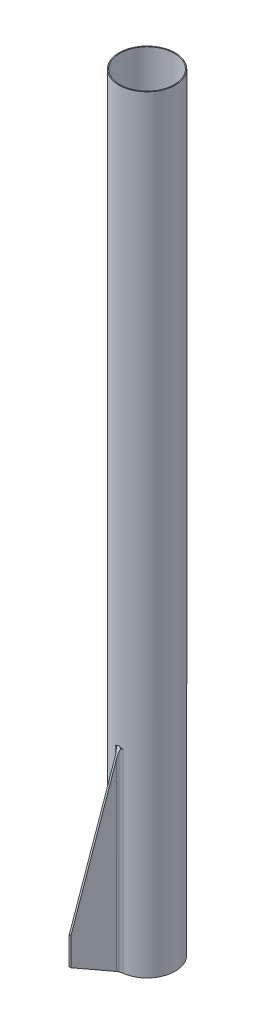
ISO-10303-21;
HEADER;
FILE_DESCRIPTION(('STEP AP214'),'2;1');
FILE_NAME('part.step','',(''),(''),'','','');
FILE_SCHEMA(('AUTOMOTIVE_DESIGN { 1 0 10303 214 1 1 1 1 }'));
ENDSEC;
DATA;
#1=APPLICATION_CONTEXT('core data for automotive mechanical design processes');
#2=APPLICATION_PROTOCOL_DEFINITION('international standard','automotive_design',2000,#1);
#3=PRODUCT_CONTEXT('',#1,'mechanical');
#4=PRODUCT('Part','Part','',(#3));
#5=PRODUCT_RELATED_PRODUCT_CATEGORY('part','',(#4));
#6=PRODUCT_DEFINITION_FORMATION('','',#4);
#7=PRODUCT_DEFINITION_CONTEXT('part definition',#1,'design');
#8=PRODUCT_DEFINITION('design','',#6,#7);
#9=PRODUCT_DEFINITION_SHAPE('','',#8);
#10=(LENGTH_UNIT() NAMED_UNIT(*) SI_UNIT(.MILLI.,.METRE.));
#11=(NAMED_UNIT(*) PLANE_ANGLE_UNIT() SI_UNIT($,.RADIAN.));
#12=(NAMED_UNIT(*) SI_UNIT($,.STERADIAN.) SOLID_ANGLE_UNIT());
#13=UNCERTAINTY_MEASURE_WITH_UNIT(LENGTH_MEASURE(1.E-05),#10,'distance_accuracy_value','');
#14=(GEOMETRIC_REPRESENTATION_CONTEXT(3) GLOBAL_UNCERTAINTY_ASSIGNED_CONTEXT((#13)) GLOBAL_UNIT_ASSIGNED_CONTEXT((#10,
#11,#12)) REPRESENTATION_CONTEXT('',''));
#15=CARTESIAN_POINT('',(0.,0.,0.));
#16=DIRECTION('',(0.,0.,1.));
#17=DIRECTION('',(1.,0.,0.));
#18=AXIS2_PLACEMENT_3D('',#15,#16,#17);
#19=CARTESIAN_POINT('',(0.,1397.,0.));
#20=DIRECTION('',(0.,-1.,0.));
#21=DIRECTION('',(0.,0.,-1.));
#22=AXIS2_PLACEMENT_3D('',#19,#20,#21);
#23=CYLINDRICAL_SURFACE('',#22,51.1175);
#24=CARTESIAN_POINT('',(-7.06042817679558,353.06,50.6275533697838));
#25=CARTESIAN_POINT('',(-6.98178910442708,353.059995409037,50.6385205075114));
#26=CARTESIAN_POINT('',(-6.90313413518507,353.061674923988,50.6493024765275));
#27=CARTESIAN_POINT('',(-6.74592232785326,353.068358490297,50.6704807973714));
#28=CARTESIAN_POINT('',(-6.66736547972724,353.073362167958,50.6808771924061));
#29=CARTESIAN_POINT('',(-6.4322747485373,353.093272134073,50.7114343822477));
#30=CARTESIAN_POINT('',(-6.27605493475863,353.113077651771,50.7310002218009));
#31=CARTESIAN_POINT('',(-5.9673980462708,353.164584729604,50.7682268062427));
#32=CARTESIAN_POINT('',(-5.8149380756428,353.196137619398,50.7859079491897));
#33=CARTESIAN_POINT('',(-5.51242092019625,353.269976066679,50.8196340413945));
#34=CARTESIAN_POINT('',(-5.36236474439893,353.312266011846,50.8356783179832));
#35=CARTESIAN_POINT('',(-4.95302505456859,353.44165915538,50.8776473947999));
#36=CARTESIAN_POINT('',(-4.69664478607403,353.538516917581,50.9019066348761));
#37=CARTESIAN_POINT('',(-4.19287318810551,353.754169257756,50.9458802603779));
#38=CARTESIAN_POINT('',(-3.94549036949776,353.87298399091,50.9655904323417));
#39=CARTESIAN_POINT('',(-3.45759263392632,354.127606647315,51.001019734172));
#40=CARTESIAN_POINT('',(-3.21712622649114,354.263509700713,51.0167148997689));
#41=CARTESIAN_POINT('',(-2.74346712945002,354.547469421086,51.0443773532438));
#42=CARTESIAN_POINT('',(-2.51027150552589,354.695521095205,51.0563461629848));
#43=CARTESIAN_POINT('',(-2.16310479409504,354.925728984331,51.0718461652114));
#44=CARTESIAN_POINT('',(-2.04690485514555,355.00448127992,51.0766320121317));
#45=CARTESIAN_POINT('',(-1.81609221976753,355.163937969934,51.0853593477959));
#46=CARTESIAN_POINT('',(-1.70147728475385,355.244639045796,51.0893021728531));
#47=CARTESIAN_POINT('',(-1.52356920214307,355.372019901449,51.0948297539313));
#48=CARTESIAN_POINT('',(-1.45983902056785,355.418078857476,51.0966897357566));
#49=CARTESIAN_POINT('',(-1.39629860202458,355.464399742162,51.0984261642566));
#50=B_SPLINE_CURVE_WITH_KNOTS('',3,(#24,#25,#26,#27,#28,#29,#30,#31,#32,#33,#34,#35,#36,#37,#38,
#39,#40,#41,#42,#43,#44,#45,#46,#47,#48,#49),.UNSPECIFIED.,.F.,.F.,(4,2,2,2,2,2,2,2,2,2,2,2,4),
(0.,0.238163472875327,0.476300176229461,0.951771227302534,1.42141884265455,1.89125868847703,
2.71516229103628,3.53982597851974,4.3693026457978,5.19844010481587,5.61978221735824,
6.04045140628227,6.276408219429),.UNSPECIFIED.);
#51=CARTESIAN_POINT('',(-7.06042817679558,353.06,50.6275533697838));
#52=VERTEX_POINT('',#51);
#53=CARTESIAN_POINT('',(-1.39629860202458,355.464399742162,51.0984261642566));
#54=VERTEX_POINT('',#53);
#55=EDGE_CURVE('E61',#52,#54,#50,.T.);
#56=ORIENTED_EDGE('',*,*,#55,.T.);
#57=CARTESIAN_POINT('',(0.,505.68662262913,0.));
#58=DIRECTION('',(-0.707106781186555,0.233593025493097,0.667408644265992));
#59=DIRECTION('',(-0.169874893340701,-0.972334458116641,0.160337837616403));
#60=AXIS2_PLACEMENT_3D('',#57,#58,#59);
#61=ELLIPSE('',#60,218.831447951388,51.1175);
#62=CARTESIAN_POINT('',(-1.33350000000001,355.649704109889,51.1001035615389));
#63=VERTEX_POINT('',#62);
#64=EDGE_CURVE('E289',#54,#63,#61,.T.);
#65=ORIENTED_EDGE('',*,*,#64,.T.);
#66=CARTESIAN_POINT('',(0.,501.65,0.));
#67=DIRECTION('',(0.,0.330350424728106,0.943858356366017));
#68=DIRECTION('',(0.,-0.943858356366017,0.330350424728106));
#69=AXIS2_PLACEMENT_3D('',#66,#67,#68);
#70=ELLIPSE('',#69,154.737200783296,51.1175);
#71=CARTESIAN_POINT('',(1.33349999999998,355.649704109889,51.1001035615389));
#72=VERTEX_POINT('',#71);
#73=EDGE_CURVE('E163',#63,#72,#70,.T.);
#74=ORIENTED_EDGE('',*,*,#73,.T.);
#75=CARTESIAN_POINT('',(0.,505.68662262913,0.));
#76=DIRECTION('',(-0.707106781186559,-0.233593025493096,-0.667408644265989));
#77=DIRECTION('',(0.169874893340701,-0.972334458116641,0.160337837616402));
#78=AXIS2_PLACEMENT_3D('',#75,#76,#77);
#79=ELLIPSE('',#78,218.831447951389,51.1175);
#80=CARTESIAN_POINT('',(1.39629860202456,355.464399742162,51.0984261642566));
#81=VERTEX_POINT('',#80);
#82=EDGE_CURVE('E11',#72,#81,#79,.F.);
#83=ORIENTED_EDGE('',*,*,#82,.T.);
#84=CARTESIAN_POINT('',(1.39629860202455,355.464399742162,51.0984261642566));
#85=CARTESIAN_POINT('',(1.42804579879113,355.441254706117,51.0975586803109));
#86=CARTESIAN_POINT('',(1.45984015870446,355.418176580778,51.0966602569672));
#87=CARTESIAN_POINT('',(1.523572801179,355.372123956614,51.0947996216056));
#88=CARTESIAN_POINT('',(1.555511226205,355.349149658646,51.0938373182388));
#89=CARTESIAN_POINT('',(1.83562608240468,355.148589453542,51.0851341959556));
#90=CARTESIAN_POINT('',(2.08678143846738,354.975178756634,51.0755247705319));
#91=CARTESIAN_POINT('',(2.59659894193837,354.639758551708,51.052146177369));
#92=CARTESIAN_POINT('',(2.85526384269028,354.477753301957,51.0383754660468));
#93=CARTESIAN_POINT('',(3.38008021255677,354.170396616806,51.0062996110343));
#94=CARTESIAN_POINT('',(3.64617847111905,354.024952513409,50.9880217157513));
#95=CARTESIAN_POINT('',(4.18880879403698,353.755728182577,50.9463110660863));
#96=CARTESIAN_POINT('',(4.46533430414826,353.631934613385,50.9228815065639));
#97=CARTESIAN_POINT('',(4.93078300467911,353.452370690139,50.8794663829429));
#98=CARTESIAN_POINT('',(5.11651483545397,353.387953022208,50.8611428261543));
#99=CARTESIAN_POINT('',(5.49229763535426,353.274501211012,50.8219350339973));
#100=CARTESIAN_POINT('',(5.6823448179065,353.225454100542,50.8010529778822));
#101=CARTESIAN_POINT('',(5.97156979850902,353.164998433069,50.7675960555298));
#102=CARTESIAN_POINT('',(6.06949699167053,353.146939254496,50.7559830850466));
#103=CARTESIAN_POINT('',(6.26605490771943,353.115734445479,50.73209199936));
#104=CARTESIAN_POINT('',(6.36468559071324,353.102588538636,50.7198139216171));
#105=CARTESIAN_POINT('',(6.5627250493502,353.081414225684,50.694570064212));
#106=CARTESIAN_POINT('',(6.66213529203401,353.073401898259,50.6816022603068));
#107=CARTESIAN_POINT('',(6.86118464006788,353.062685456622,50.6550398936133));
#108=CARTESIAN_POINT('',(6.96082380047137,353.059982791628,50.6414451607471));
#109=CARTESIAN_POINT('',(7.06042817679559,353.06,50.6275533697838));
#110=B_SPLINE_CURVE_WITH_KNOTS('',3,(#84,#85,#86,#87,#88,#89,#90,#91,#92,#93,#94,#95,#96,#97,
#98,#99,#100,#101,#102,#103,#104,#105,#106,#107,#108,#109),.UNSPECIFIED.,.F.,.F.,(4,2,2,2,2,2,2,
2,2,2,2,2,4),(0.,0.117892525397413,0.235957429437479,1.15174689660116,2.06787648361516,
2.97859780523609,3.88875591834902,4.48054950592815,5.07184248072089,5.37249781550685,
5.67313623414907,5.97471172602001,6.27636951841922),.UNSPECIFIED.);
#111=CARTESIAN_POINT('',(7.06042817679558,353.06,50.6275533697838));
#112=VERTEX_POINT('',#111);
#113=EDGE_CURVE('E53',#81,#112,#110,.T.);
#114=ORIENTED_EDGE('',*,*,#113,.T.);
#115=DIRECTION('',(0.,-1.,0.));
#116=VECTOR('',#115,1.);
#117=CARTESIAN_POINT('',(7.06042817679558,355.6,50.6275533697838));
#118=LINE('',#117,#116);
#119=CARTESIAN_POINT('',(7.06042817679558,0.,50.6275533697838));
#120=VERTEX_POINT('',#119);
#121=EDGE_CURVE('E169',#112,#120,#118,.T.);
#122=ORIENTED_EDGE('',*,*,#121,.T.);
#123=CARTESIAN_POINT('',(0.,0.,0.));
#124=DIRECTION('',(0.,1.,0.));
#125=DIRECTION('',(0.,0.,1.));
#126=AXIS2_PLACEMENT_3D('',#123,#124,#125);
#127=CIRCLE('',#126,51.1175);
#128=CARTESIAN_POINT('',(-7.06042817679558,0.,50.6275533697838));
#129=VERTEX_POINT('',#128);
#130=EDGE_CURVE('E175',#120,#129,#127,.T.);
#131=ORIENTED_EDGE('',*,*,#130,.T.);
#132=DIRECTION('',(0.,-1.,0.));
#133=VECTOR('',#132,1.);
#134=CARTESIAN_POINT('',(-7.06042817679558,355.6,50.6275533697838));
#135=LINE('',#134,#133);
#136=EDGE_CURVE('E144',#52,#129,#135,.T.);
#137=ORIENTED_EDGE('',*,*,#136,.F.);
#138=EDGE_LOOP('',(#56,#65,#74,#83,#114,#122,#131,#137));
#139=FACE_BOUND('',#138,.T.);
#140=CARTESIAN_POINT('',(0.,1397.,0.));
#141=DIRECTION('',(0.,1.,0.));
#142=DIRECTION('',(0.,0.,1.));
#143=AXIS2_PLACEMENT_3D('',#140,#141,#142);
#144=CIRCLE('',#143,51.1175);
#145=CARTESIAN_POINT('',(0.,1397.,51.1175));
#146=VERTEX_POINT('',#145);
#147=EDGE_CURVE('E178',#146,#146,#144,.T.);
#148=ORIENTED_EDGE('',*,*,#147,.F.);
#149=EDGE_LOOP('',(#148));
#150=FACE_BOUND('',#149,.T.);
#151=ADVANCED_FACE('F37',(#139,#150),#23,.T.);
#152=CARTESIAN_POINT('',(-1.5875,0.,0.));
#153=DIRECTION('',(1.,0.,0.));
#154=DIRECTION('',(0.,0.,-1.));
#155=AXIS2_PLACEMENT_3D('',#152,#153,#154);
#156=PLANE('',#155);
#157=DIRECTION('',(0.,-0.943858356366018,0.330350424728106));
#158=VECTOR('',#157,1.);
#159=CARTESIAN_POINT('',(-1.5875,54.7457683741648,156.416481069042));
#160=LINE('',#159,#158);
#161=CARTESIAN_POINT('',(-1.5875,339.030884473277,56.9166904343533));
#162=VERTEX_POINT('',#161);
#163=CARTESIAN_POINT('',(-1.5875,101.6,140.0175));
#164=VERTEX_POINT('',#163);
#165=EDGE_CURVE('E126',#162,#164,#160,.T.);
#166=ORIENTED_EDGE('',*,*,#165,.F.);
#167=DIRECTION('',(0.,-1.,0.));
#168=VECTOR('',#167,1.);
#169=CARTESIAN_POINT('',(-1.5875,355.6,56.9166904343533));
#170=LINE('',#169,#168);
#171=CARTESIAN_POINT('',(-1.5875,3.31382310534478,56.9166904343533));
#172=VERTEX_POINT('',#171);
#173=EDGE_CURVE('E137',#162,#172,#170,.T.);
#174=ORIENTED_EDGE('',*,*,#173,.T.);
#175=DIRECTION('',(0.,-0.496138938356834,-0.868243142124459));
#176=VECTOR('',#175,1.);
#177=CARTESIAN_POINT('',(-1.5875,-22.0198461538462,12.5827692307692));
#178=LINE('',#177,#176);
#179=CARTESIAN_POINT('',(-1.5875,50.8,140.0175));
#180=VERTEX_POINT('',#179);
#181=EDGE_CURVE('E152',#180,#172,#178,.T.);
#182=ORIENTED_EDGE('',*,*,#181,.F.);
#183=DIRECTION('',(0.,-1.,0.));
#184=VECTOR('',#183,1.);
#185=CARTESIAN_POINT('',(-1.5875,0.,140.0175));
#186=LINE('',#185,#184);
#187=EDGE_CURVE('E150',#164,#180,#186,.T.);
#188=ORIENTED_EDGE('',*,*,#187,.F.);
#189=EDGE_LOOP('',(#166,#174,#182,#188));
#190=FACE_BOUND('',#189,.T.);
#191=ADVANCED_FACE('F148',(#190),#156,.F.);
#192=CARTESIAN_POINT('',(0.,0.,0.));
#193=DIRECTION('',(0.,1.,0.));
#194=DIRECTION('',(0.,0.,1.));
#195=AXIS2_PLACEMENT_3D('',#192,#193,#194);
#196=PLANE('',#195);
#197=CARTESIAN_POINT('',(0.,0.,0.));
#198=DIRECTION('',(0.,1.,0.));
#199=DIRECTION('',(0.,0.,1.));
#200=AXIS2_PLACEMENT_3D('',#197,#198,#199);
#201=CIRCLE('',#200,49.53);
#202=CARTESIAN_POINT('',(0.,0.,49.53));
#203=VERTEX_POINT('',#202);
#204=EDGE_CURVE('E171',#203,#203,#201,.T.);
#205=ORIENTED_EDGE('',*,*,#204,.T.);
#206=EDGE_LOOP('',(#205));
#207=FACE_BOUND('',#206,.T.);
#208=CARTESIAN_POINT('',(-7.9375,0.,56.9166904343533));
#209=DIRECTION('',(0.,-1.,0.));
#210=DIRECTION('',(0.,0.,-1.));
#211=AXIS2_PLACEMENT_3D('',#208,#209,#210);
#212=CIRCLE('',#211,6.35);
#213=CARTESIAN_POINT('',(-5.35063117725186,0.,51.1175000000001));
#214=VERTEX_POINT('',#213);
#215=EDGE_CURVE('E145',#129,#214,#212,.T.);
#216=ORIENTED_EDGE('',*,*,#215,.F.);
#217=ORIENTED_EDGE('',*,*,#130,.F.);
#218=CARTESIAN_POINT('',(7.9375,0.,56.9166904343533));
#219=DIRECTION('',(0.,-1.,0.));
#220=DIRECTION('',(0.,0.,1.));
#221=AXIS2_PLACEMENT_3D('',#218,#219,#220);
#222=CIRCLE('',#221,6.35);
#223=CARTESIAN_POINT('',(5.35063117725186,0.,51.1175000000001));
#224=VERTEX_POINT('',#223);
#225=EDGE_CURVE('E166',#224,#120,#222,.T.);
#226=ORIENTED_EDGE('',*,*,#225,.F.);
#227=DIRECTION('',(1.,0.,0.));
#228=VECTOR('',#227,1.);
#229=CARTESIAN_POINT('',(-51.1175,0.,51.1175000000001));
#230=LINE('',#229,#228);
#231=EDGE_CURVE('E267',#214,#224,#230,.T.);
#232=ORIENTED_EDGE('',*,*,#231,.F.);
#233=EDGE_LOOP('',(#216,#217,#226,#232));
#234=FACE_BOUND('',#233,.T.);
#235=ADVANCED_FACE('F223',(#207,#234),#196,.F.);
#236=CARTESIAN_POINT('',(0.,1397.,0.));
#237=DIRECTION('',(0.,1.,0.));
#238=DIRECTION('',(0.,0.,1.));
#239=AXIS2_PLACEMENT_3D('',#236,#237,#238);
#240=PLANE('',#239);
#241=ORIENTED_EDGE('',*,*,#147,.T.);
#242=EDGE_LOOP('',(#241));
#243=FACE_BOUND('',#242,.T.);
#244=CARTESIAN_POINT('',(0.,1397.,0.));
#245=DIRECTION('',(0.,1.,0.));
#246=DIRECTION('',(0.,0.,1.));
#247=AXIS2_PLACEMENT_3D('',#244,#245,#246);
#248=CIRCLE('',#247,49.53);
#249=CARTESIAN_POINT('',(0.,1397.,49.53));
#250=VERTEX_POINT('',#249);
#251=EDGE_CURVE('E172',#250,#250,#248,.T.);
#252=ORIENTED_EDGE('',*,*,#251,.F.);
#253=EDGE_LOOP('',(#252));
#254=FACE_BOUND('',#253,.T.);
#255=ADVANCED_FACE('F227',(#243,#254),#240,.T.);
#256=CARTESIAN_POINT('',(0.,1397.,0.));
#257=DIRECTION('',(0.,-1.,0.));
#258=DIRECTION('',(0.,0.,-1.));
#259=AXIS2_PLACEMENT_3D('',#256,#257,#258);
#260=CYLINDRICAL_SURFACE('',#259,49.53);
#261=ORIENTED_EDGE('',*,*,#204,.F.);
#262=EDGE_LOOP('',(#261));
#263=FACE_BOUND('',#262,.T.);
#264=ORIENTED_EDGE('',*,*,#251,.T.);
#265=EDGE_LOOP('',(#264));
#266=FACE_BOUND('',#265,.T.);
#267=ADVANCED_FACE('F231',(#263,#266),#260,.F.);
#268=CARTESIAN_POINT('',(7.9375,355.6,56.9166904343533));
#269=DIRECTION('',(0.,-1.,0.));
#270=DIRECTION('',(0.,0.,-1.));
#271=AXIS2_PLACEMENT_3D('',#268,#269,#270);
#272=CYLINDRICAL_SURFACE('',#271,6.35);
#273=ORIENTED_EDGE('',*,*,#121,.F.);
#274=CARTESIAN_POINT('',(7.9375,353.06,56.9166904343533));
#275=DIRECTION('',(0.,1.,0.));
#276=DIRECTION('',(0.,0.,1.));
#277=AXIS2_PLACEMENT_3D('',#274,#275,#276);
#278=CIRCLE('',#277,6.35);
#279=CARTESIAN_POINT('',(3.91102140221926,353.06,52.0065000000001));
#280=VERTEX_POINT('',#279);
#281=EDGE_CURVE('E273',#112,#280,#278,.T.);
#282=ORIENTED_EDGE('',*,*,#281,.T.);
#283=CARTESIAN_POINT('',(7.9375,339.030884473277,56.9166904343533));
#284=DIRECTION('',(0.,-0.330350424728106,-0.943858356366017));
#285=DIRECTION('',(0.,-0.943858356366017,0.330350424728106));
#286=AXIS2_PLACEMENT_3D('',#283,#284,#285);
#287=ELLIPSE('',#286,19.2220125196641,6.35);
#288=CARTESIAN_POINT('',(1.5875,339.030884473277,56.9166904343532));
#289=VERTEX_POINT('',#288);
#290=EDGE_CURVE('E133',#280,#289,#287,.F.);
#291=ORIENTED_EDGE('',*,*,#290,.T.);
#292=DIRECTION('',(0.,-1.,0.));
#293=VECTOR('',#292,1.);
#294=CARTESIAN_POINT('',(1.5875,355.6,56.9166904343533));
#295=LINE('',#294,#293);
#296=CARTESIAN_POINT('',(1.5875,3.3138231053447,56.9166904343532));
#297=VERTEX_POINT('',#296);
#298=EDGE_CURVE('E159',#297,#289,#295,.F.);
#299=ORIENTED_EDGE('',*,*,#298,.F.);
#300=CARTESIAN_POINT('',(7.9375,3.31382310534473,56.9166904343533));
#301=DIRECTION('',(0.,0.868243142124459,-0.496138938356834));
#302=DIRECTION('',(0.,-0.496138938356834,-0.868243142124459));
#303=AXIS2_PLACEMENT_3D('',#300,#301,#302);
#304=ELLIPSE('',#303,7.31361952881369,6.35);
#305=EDGE_CURVE('E263',#297,#224,#304,.F.);
#306=ORIENTED_EDGE('',*,*,#305,.T.);
#307=ORIENTED_EDGE('',*,*,#225,.T.);
#308=EDGE_LOOP('',(#273,#282,#291,#299,#306,#307));
#309=FACE_BOUND('',#308,.T.);
#310=ADVANCED_FACE('F235',(#309),#272,.F.);
#311=CARTESIAN_POINT('',(-1.5875,54.7457683741648,156.416481069042));
#312=DIRECTION('',(0.,0.330350424728106,0.943858356366017));
#313=DIRECTION('',(0.,-0.943858356366018,0.330350424728106));
#314=AXIS2_PLACEMENT_3D('',#311,#312,#313);
#315=PLANE('',#314);
#316=ORIENTED_EDGE('',*,*,#73,.F.);
#317=DIRECTION('',(0.,-0.943858356366018,0.330350424728106));
#318=VECTOR('',#317,1.);
#319=CARTESIAN_POINT('',(-1.33349999999999,355.22062156477,51.2502824523305));
#320=LINE('',#319,#318);
#321=CARTESIAN_POINT('',(-1.33349999999999,355.46853011643,51.1635144592495));
#322=VERTEX_POINT('',#321);
#323=EDGE_CURVE('E290',#63,#322,#320,.T.);
#324=ORIENTED_EDGE('',*,*,#323,.T.);
#325=CARTESIAN_POINT('',(-1.33350000000745,355.46853011643,51.1635144592496));
#326=CARTESIAN_POINT('',(-1.37576473119674,355.427148233373,51.1779981183196));
#327=CARTESIAN_POINT('',(-1.41806292125725,355.385796880941,51.1924710916706));
#328=CARTESIAN_POINT('',(-1.50272843492694,355.303159638488,51.2213941265292));
#329=CARTESIAN_POINT('',(-1.54509575645863,355.26187374657,51.2358441887006));
#330=CARTESIAN_POINT('',(-1.77676788120869,355.036495817146,51.3147264639988));
#331=CARTESIAN_POINT('',(-1.96677132652967,354.853041646003,51.3789354238989));
#332=CARTESIAN_POINT('',(-2.34865576565077,354.487887876296,51.5067392432965));
#333=CARTESIAN_POINT('',(-2.54053672338272,354.306188244158,51.5703341145446));
#334=CARTESIAN_POINT('',(-2.92680947759694,353.945078143558,51.6967226497548));
#335=CARTESIAN_POINT('',(-3.12120191301387,353.765668281658,51.7595161014196));
#336=CARTESIAN_POINT('',(-3.41527930081463,353.498977605028,51.8528578382403));
#337=CARTESIAN_POINT('',(-3.51372519225107,353.410480086115,51.8838319698597));
#338=CARTESIAN_POINT('',(-3.7115991987783,353.234463225373,51.9454378711196));
#339=CARTESIAN_POINT('',(-3.81102734569039,353.14694391543,51.9760696295996));
#340=CARTESIAN_POINT('',(-3.91102140221925,353.06,52.0065000000001));
#341=B_SPLINE_CURVE_WITH_KNOTS('',3,(#325,#326,#327,#328,#329,#330,#331,#332,#333,#334,#335,
#336,#337,#338,#339,#340),.UNSPECIFIED.,.F.,.F.,(4,2,2,2,2,2,2,4),(0.,0.182693296000427,
0.365381199405311,1.18079375041967,1.99619066749767,2.81179927927038,3.21964700582233,
3.62750798868434),.UNSPECIFIED.);
#342=CARTESIAN_POINT('',(-3.91102140221926,353.06,52.0065000000001));
#343=VERTEX_POINT('',#342);
#344=EDGE_CURVE('E129',#322,#343,#341,.T.);
#345=ORIENTED_EDGE('',*,*,#344,.T.);
#346=CARTESIAN_POINT('',(-7.9375,339.030884473277,56.9166904343533));
#347=DIRECTION('',(0.,-0.330350424728106,-0.943858356366017));
#348=DIRECTION('',(0.,-0.943858356366017,0.330350424728106));
#349=AXIS2_PLACEMENT_3D('',#346,#347,#348);
#350=ELLIPSE('',#349,19.2220125196641,6.35);
#351=EDGE_CURVE('E120',#162,#343,#350,.F.);
#352=ORIENTED_EDGE('',*,*,#351,.F.);
#353=ORIENTED_EDGE('',*,*,#165,.T.);
#354=DIRECTION('',(1.,0.,0.));
#355=VECTOR('',#354,1.);
#356=CARTESIAN_POINT('',(-1.5875,101.6,140.0175));
#357=LINE('',#356,#355);
#358=CARTESIAN_POINT('',(1.5875,101.6,140.0175));
#359=VERTEX_POINT('',#358);
#360=EDGE_CURVE('E154',#164,#359,#357,.T.);
#361=ORIENTED_EDGE('',*,*,#360,.T.);
#362=DIRECTION('',(0.,-0.943858356366018,0.330350424728106));
#363=VECTOR('',#362,1.);
#364=CARTESIAN_POINT('',(1.5875,54.7457683741648,156.416481069042));
#365=LINE('',#364,#363);
#366=EDGE_CURVE('E253',#289,#359,#365,.T.);
#367=ORIENTED_EDGE('',*,*,#366,.F.);
#368=ORIENTED_EDGE('',*,*,#290,.F.);
#369=CARTESIAN_POINT('',(3.91102140221926,353.06,52.0065000000001));
#370=CARTESIAN_POINT('',(3.8110273456904,353.14694391543,51.9760696295996));
#371=CARTESIAN_POINT('',(3.71159919877831,353.234463225373,51.9454378711196));
#372=CARTESIAN_POINT('',(3.51372519225108,353.410480086115,51.8838319698597));
#373=CARTESIAN_POINT('',(3.41527930081464,353.498977605028,51.8528578382403));
#374=CARTESIAN_POINT('',(3.12120191301388,353.765668281658,51.7595161014196));
#375=CARTESIAN_POINT('',(2.92680947759693,353.945078143558,51.6967226497548));
#376=CARTESIAN_POINT('',(2.5405367233827,354.306188244158,51.5703341145446));
#377=CARTESIAN_POINT('',(2.34865576565074,354.487887876296,51.5067392432965));
#378=CARTESIAN_POINT('',(1.96677132652965,354.853041646003,51.378935423899));
#379=CARTESIAN_POINT('',(1.77676788120867,355.036495817146,51.3147264639989));
#380=CARTESIAN_POINT('',(1.54509575646045,355.261873746568,51.2358441887012));
#381=CARTESIAN_POINT('',(1.50272843493056,355.303159638485,51.2213941265305));
#382=CARTESIAN_POINT('',(1.41806292126447,355.385796880934,51.192471091673));
#383=CARTESIAN_POINT('',(1.37576473120575,355.427148233364,51.1779981183227));
#384=CARTESIAN_POINT('',(1.33350000001825,355.468530116419,51.1635144592533));
#385=B_SPLINE_CURVE_WITH_KNOTS('',3,(#369,#370,#371,#372,#373,#374,#375,#376,#377,#378,#379,
#380,#381,#382,#383,#384),.UNSPECIFIED.,.F.,.F.,(4,2,2,2,2,2,2,4),(0.,0.407860982862014,
0.815708709413959,1.63131732118668,2.44671423826475,3.26212678927904,3.44481469267609,
3.62750798866877),.UNSPECIFIED.);
#386=CARTESIAN_POINT('',(1.33349999999998,355.468530116419,51.1635144592533));
#387=VERTEX_POINT('',#386);
#388=EDGE_CURVE('E181',#280,#387,#385,.T.);
#389=ORIENTED_EDGE('',*,*,#388,.T.);
#390=DIRECTION('',(0.,0.943858356366018,-0.330350424728106));
#391=VECTOR('',#390,1.);
#392=CARTESIAN_POINT('',(1.33349999999998,54.7457683741648,156.416481069042));
#393=LINE('',#392,#391);
#394=EDGE_CURVE('E214',#387,#72,#393,.T.);
#395=ORIENTED_EDGE('',*,*,#394,.T.);
#396=EDGE_LOOP('',(#316,#324,#345,#352,#353,#361,#367,#368,#389,#395));
#397=FACE_BOUND('',#396,.T.);
#398=ADVANCED_FACE('F123',(#397),#315,.T.);
#399=CARTESIAN_POINT('',(1.5875,0.,0.));
#400=DIRECTION('',(1.,0.,0.));
#401=DIRECTION('',(0.,0.,-1.));
#402=AXIS2_PLACEMENT_3D('',#399,#400,#401);
#403=PLANE('',#402);
#404=DIRECTION('',(0.,-0.496138938356834,-0.868243142124459));
#405=VECTOR('',#404,1.);
#406=CARTESIAN_POINT('',(1.5875,-22.0198461538462,12.5827692307692));
#407=LINE('',#406,#405);
#408=CARTESIAN_POINT('',(1.5875,50.8,140.0175));
#409=VERTEX_POINT('',#408);
#410=EDGE_CURVE('E254',#409,#297,#407,.T.);
#411=ORIENTED_EDGE('',*,*,#410,.T.);
#412=ORIENTED_EDGE('',*,*,#298,.T.);
#413=ORIENTED_EDGE('',*,*,#366,.T.);
#414=DIRECTION('',(0.,-1.,0.));
#415=VECTOR('',#414,1.);
#416=CARTESIAN_POINT('',(1.5875,0.,140.0175));
#417=LINE('',#416,#415);
#418=EDGE_CURVE('E258',#359,#409,#417,.T.);
#419=ORIENTED_EDGE('',*,*,#418,.T.);
#420=EDGE_LOOP('',(#411,#412,#413,#419));
#421=FACE_BOUND('',#420,.T.);
#422=ADVANCED_FACE('F243',(#421),#403,.T.);
#423=CARTESIAN_POINT('',(-1.5875,0.,140.0175));
#424=DIRECTION('',(0.,0.,1.));
#425=DIRECTION('',(0.,-1.,0.));
#426=AXIS2_PLACEMENT_3D('',#423,#424,#425);
#427=PLANE('',#426);
#428=DIRECTION('',(1.,0.,0.));
#429=VECTOR('',#428,1.);
#430=CARTESIAN_POINT('',(-1.5875,50.8,140.0175));
#431=LINE('',#430,#429);
#432=EDGE_CURVE('E151',#180,#409,#431,.T.);
#433=ORIENTED_EDGE('',*,*,#432,.T.);
#434=ORIENTED_EDGE('',*,*,#418,.F.);
#435=ORIENTED_EDGE('',*,*,#360,.F.);
#436=ORIENTED_EDGE('',*,*,#187,.T.);
#437=EDGE_LOOP('',(#433,#434,#435,#436));
#438=FACE_BOUND('',#437,.T.);
#439=ADVANCED_FACE('F240',(#438),#427,.T.);
#440=CARTESIAN_POINT('',(-1.5875,-22.0198461538462,12.5827692307692));
#441=DIRECTION('',(0.,-0.868243142124459,0.496138938356834));
#442=DIRECTION('',(0.,-0.496138938356834,-0.868243142124459));
#443=AXIS2_PLACEMENT_3D('',#440,#441,#442);
#444=PLANE('',#443);
#445=ORIENTED_EDGE('',*,*,#181,.T.);
#446=CARTESIAN_POINT('',(-7.9375,3.31382310534473,56.9166904343533));
#447=DIRECTION('',(0.,0.868243142124459,-0.496138938356834));
#448=DIRECTION('',(0.,-0.496138938356834,-0.868243142124459));
#449=AXIS2_PLACEMENT_3D('',#446,#447,#448);
#450=ELLIPSE('',#449,7.31361952881369,6.35);
#451=EDGE_CURVE('E141',#214,#172,#450,.F.);
#452=ORIENTED_EDGE('',*,*,#451,.F.);
#453=ORIENTED_EDGE('',*,*,#231,.T.);
#454=ORIENTED_EDGE('',*,*,#305,.F.);
#455=ORIENTED_EDGE('',*,*,#410,.F.);
#456=ORIENTED_EDGE('',*,*,#432,.F.);
#457=EDGE_LOOP('',(#445,#452,#453,#454,#455,#456));
#458=FACE_BOUND('',#457,.T.);
#459=ADVANCED_FACE('F242',(#458),#444,.T.);
#460=CARTESIAN_POINT('',(-7.9375,355.6,56.9166904343533));
#461=DIRECTION('',(0.,-1.,0.));
#462=DIRECTION('',(0.,0.,-1.));
#463=AXIS2_PLACEMENT_3D('',#460,#461,#462);
#464=CYLINDRICAL_SURFACE('',#463,6.35);
#465=ORIENTED_EDGE('',*,*,#351,.T.);
#466=CARTESIAN_POINT('',(-7.9375,353.06,56.9166904343533));
#467=DIRECTION('',(0.,-1.,0.));
#468=DIRECTION('',(0.,0.,-1.));
#469=AXIS2_PLACEMENT_3D('',#466,#467,#468);
#470=CIRCLE('',#469,6.35);
#471=EDGE_CURVE('E282',#343,#52,#470,.F.);
#472=ORIENTED_EDGE('',*,*,#471,.T.);
#473=ORIENTED_EDGE('',*,*,#136,.T.);
#474=ORIENTED_EDGE('',*,*,#215,.T.);
#475=ORIENTED_EDGE('',*,*,#451,.T.);
#476=ORIENTED_EDGE('',*,*,#173,.F.);
#477=EDGE_LOOP('',(#465,#472,#473,#474,#475,#476));
#478=FACE_BOUND('',#477,.T.);
#479=ADVANCED_FACE('F138',(#478),#464,.F.);
#480=CARTESIAN_POINT('',(-7.9375,355.6,56.9166904343533));
#481=DIRECTION('',(0.,1.,0.));
#482=DIRECTION('',(0.,0.,1.));
#483=AXIS2_PLACEMENT_3D('',#480,#481,#482);
#484=CONICAL_SURFACE('',#483,8.89000000000005,0.785398163397449);
#485=ORIENTED_EDGE('',*,*,#55,.F.);
#486=ORIENTED_EDGE('',*,*,#471,.F.);
#487=ORIENTED_EDGE('',*,*,#344,.F.);
#488=CARTESIAN_POINT('',(-1.33349999999999,355.46853011643,51.1635144592495));
#489=CARTESIAN_POINT('',(-1.34397477178538,355.46774017366,51.1526931174805));
#490=CARTESIAN_POINT('',(-1.35444233244153,355.467001175106,51.1418615852903));
#491=CARTESIAN_POINT('',(-1.37537521659311,355.465624264926,51.1201655107145));
#492=CARTESIAN_POINT('',(-1.38584052327849,355.464986472057,51.1093009445736));
#493=CARTESIAN_POINT('',(-1.39629860202458,355.464399742162,51.0984261642566));
#494=B_SPLINE_CURVE_WITH_KNOTS('',3,(#488,#489,#490,#491,#492,#493),.UNSPECIFIED.,.F.,.F.,(4,2,
4),(0.,0.0452431465623087,0.0905389961593028),.UNSPECIFIED.);
#495=EDGE_CURVE('E285',#322,#54,#494,.T.);
#496=ORIENTED_EDGE('',*,*,#495,.T.);
#497=EDGE_LOOP('',(#485,#486,#487,#496));
#498=FACE_BOUND('',#497,.T.);
#499=ADVANCED_FACE('F202',(#498),#484,.F.);
#500=CARTESIAN_POINT('',(7.9375,355.6,56.9166904343533));
#501=DIRECTION('',(0.,1.,0.));
#502=DIRECTION('',(0.,0.,1.));
#503=AXIS2_PLACEMENT_3D('',#500,#501,#502);
#504=CONICAL_SURFACE('',#503,8.89000000000005,0.785398163397449);
#505=ORIENTED_EDGE('',*,*,#388,.F.);
#506=ORIENTED_EDGE('',*,*,#281,.F.);
#507=ORIENTED_EDGE('',*,*,#113,.F.);
#508=CARTESIAN_POINT('',(1.39629860202456,355.464399742162,51.0984261642566));
#509=CARTESIAN_POINT('',(1.38584052327938,355.464986472056,51.1093009445731));
#510=CARTESIAN_POINT('',(1.37537521659475,355.465624264925,51.1201655107132));
#511=CARTESIAN_POINT('',(1.35444233244232,355.467001175107,51.141861585289));
#512=CARTESIAN_POINT('',(1.34397477178458,355.467740173664,51.15269311748));
#513=CARTESIAN_POINT('',(1.33349999999743,355.468530116437,51.1635144592497));
#514=B_SPLINE_CURVE_WITH_KNOTS('',3,(#508,#509,#510,#511,#512,#513),.UNSPECIFIED.,.F.,.F.,(4,2,
4),(0.,0.0452958495937798,0.0905389961615155),.UNSPECIFIED.);
#515=EDGE_CURVE('E46',#81,#387,#514,.T.);
#516=ORIENTED_EDGE('',*,*,#515,.T.);
#517=EDGE_LOOP('',(#505,#506,#507,#516));
#518=FACE_BOUND('',#517,.T.);
#519=ADVANCED_FACE('F198',(#518),#504,.F.);
#520=CARTESIAN_POINT('',(-1.3335,54.7457683741648,156.416481069042));
#521=DIRECTION('',(-0.707106781186555,0.233593025493097,0.667408644265992));
#522=DIRECTION('',(0.,0.943858356366018,-0.330350424728106));
#523=AXIS2_PLACEMENT_3D('',#520,#521,#522);
#524=PLANE('',#523);
#525=ORIENTED_EDGE('',*,*,#64,.F.);
#526=ORIENTED_EDGE('',*,*,#495,.F.);
#527=ORIENTED_EDGE('',*,*,#323,.F.);
#528=EDGE_LOOP('',(#525,#526,#527));
#529=FACE_BOUND('',#528,.T.);
#530=ADVANCED_FACE('F201',(#529),#524,.T.);
#531=CARTESIAN_POINT('',(1.5875,54.6618593662839,156.176741046525));
#532=DIRECTION('',(-0.707106781186559,-0.233593025493096,-0.667408644265989));
#533=DIRECTION('',(0.,-0.943858356366018,0.330350424728106));
#534=AXIS2_PLACEMENT_3D('',#531,#532,#533);
#535=PLANE('',#534);
#536=ORIENTED_EDGE('',*,*,#82,.F.);
#537=ORIENTED_EDGE('',*,*,#394,.F.);
#538=ORIENTED_EDGE('',*,*,#515,.F.);
#539=EDGE_LOOP('',(#536,#537,#538));
#540=FACE_BOUND('',#539,.T.);
#541=ADVANCED_FACE('F39',(#540),#535,.F.);
#542=CLOSED_SHELL('',(#151,#191,#235,#255,#267,#310,#398,#422,#439,#459,#479,#499,#519,#530,#541));
#543=MANIFOLD_SOLID_BREP('B2',#542);
#544=ADVANCED_BREP_SHAPE_REPRESENTATION('',(#18,#543),#14);
#545=SHAPE_DEFINITION_REPRESENTATION(#9,#544);
ENDSEC;
END-ISO-10303-21;
